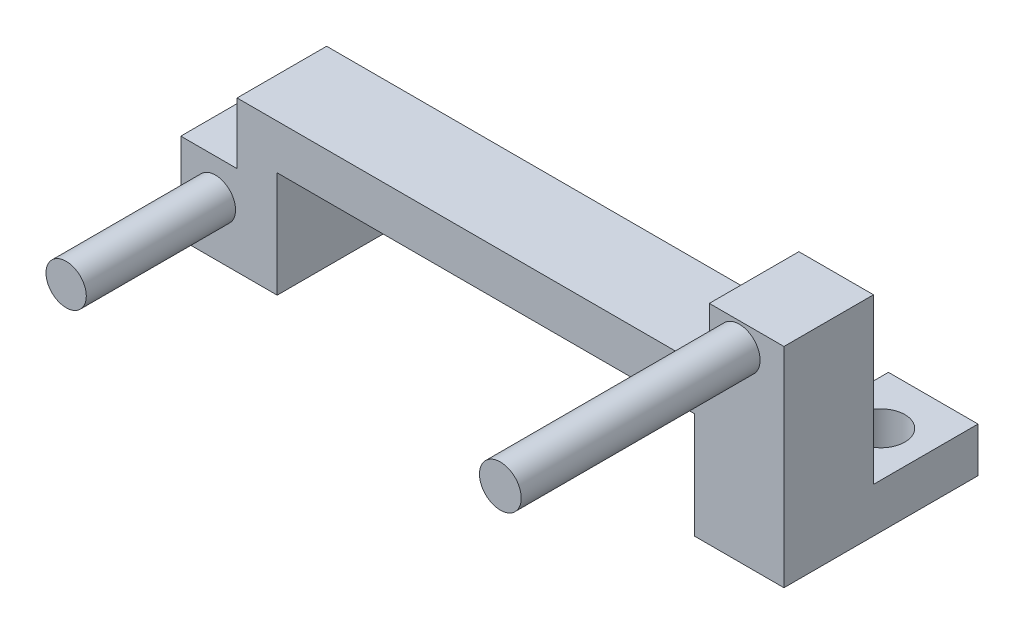
ISO-10303-21;
HEADER;
FILE_DESCRIPTION(('STEP AP214'),'2;1');
FILE_NAME('part.step','',(''),(''),'','','');
FILE_SCHEMA(('AUTOMOTIVE_DESIGN { 1 0 10303 214 1 1 1 1 }'));
ENDSEC;
DATA;
#1=APPLICATION_CONTEXT('core data for automotive mechanical design processes');
#2=APPLICATION_PROTOCOL_DEFINITION('international standard','automotive_design',2000,#1);
#3=PRODUCT_CONTEXT('',#1,'mechanical');
#4=PRODUCT('Part','Part','',(#3));
#5=PRODUCT_RELATED_PRODUCT_CATEGORY('part','',(#4));
#6=PRODUCT_DEFINITION_FORMATION('','',#4);
#7=PRODUCT_DEFINITION_CONTEXT('part definition',#1,'design');
#8=PRODUCT_DEFINITION('design','',#6,#7);
#9=PRODUCT_DEFINITION_SHAPE('','',#8);
#10=(LENGTH_UNIT() NAMED_UNIT(*) SI_UNIT(.MILLI.,.METRE.));
#11=(NAMED_UNIT(*) PLANE_ANGLE_UNIT() SI_UNIT($,.RADIAN.));
#12=(NAMED_UNIT(*) SI_UNIT($,.STERADIAN.) SOLID_ANGLE_UNIT());
#13=UNCERTAINTY_MEASURE_WITH_UNIT(LENGTH_MEASURE(1.E-05),#10,'distance_accuracy_value','');
#14=(GEOMETRIC_REPRESENTATION_CONTEXT(3) GLOBAL_UNCERTAINTY_ASSIGNED_CONTEXT((#13)) GLOBAL_UNIT_ASSIGNED_CONTEXT((#10,
#11,#12)) REPRESENTATION_CONTEXT('',''));
#15=CARTESIAN_POINT('',(0.,0.,0.));
#16=DIRECTION('',(0.,0.,1.));
#17=DIRECTION('',(1.,0.,0.));
#18=AXIS2_PLACEMENT_3D('',#15,#16,#17);
#19=CARTESIAN_POINT('',(0.,0.,20.));
#20=DIRECTION('',(0.,0.,1.));
#21=DIRECTION('',(-1.,0.,0.));
#22=AXIS2_PLACEMENT_3D('',#19,#20,#21);
#23=PLANE('',#22);
#24=DIRECTION('',(0.,1.,0.));
#25=VECTOR('',#24,1.);
#26=CARTESIAN_POINT('',(-4.43414634146342,-3.49756097560976,20.));
#27=LINE('',#26,#25);
#28=CARTESIAN_POINT('',(-4.43414634146342,-7.59756097560976,20.));
#29=VERTEX_POINT('',#28);
#30=CARTESIAN_POINT('',(-4.43414634146342,-3.49756097560976,20.));
#31=VERTEX_POINT('',#30);
#32=EDGE_CURVE('E226',#29,#31,#27,.T.);
#33=ORIENTED_EDGE('',*,*,#32,.T.);
#34=DIRECTION('',(1.,0.,0.));
#35=VECTOR('',#34,1.);
#36=CARTESIAN_POINT('',(-3.43414634146343,-3.49756097560976,20.));
#37=LINE('',#36,#35);
#38=CARTESIAN_POINT('',(-32.3841463414634,-3.49756097560976,20.));
#39=VERTEX_POINT('',#38);
#40=EDGE_CURVE('E292',#39,#31,#37,.T.);
#41=ORIENTED_EDGE('',*,*,#40,.F.);
#42=DIRECTION('',(0.,1.,0.));
#43=VECTOR('',#42,1.);
#44=CARTESIAN_POINT('',(-32.3841463414634,-3.49756097560976,20.));
#45=LINE('',#44,#43);
#46=CARTESIAN_POINT('',(-32.3841463414634,-7.59756097560976,20.));
#47=VERTEX_POINT('',#46);
#48=EDGE_CURVE('E289',#47,#39,#45,.T.);
#49=ORIENTED_EDGE('',*,*,#48,.F.);
#50=DIRECTION('',(-1.,0.,0.));
#51=VECTOR('',#50,1.);
#52=CARTESIAN_POINT('',(-32.3841463414634,-7.59756097560976,20.));
#53=LINE('',#52,#51);
#54=CARTESIAN_POINT('',(-38.8431395246063,-7.59756097560976,20.));
#55=VERTEX_POINT('',#54);
#56=EDGE_CURVE('E260',#47,#55,#53,.T.);
#57=ORIENTED_EDGE('',*,*,#56,.T.);
#58=DIRECTION('',(0.,-1.,0.));
#59=VECTOR('',#58,1.);
#60=CARTESIAN_POINT('',(-38.8431395246063,-10.5975609756098,20.));
#61=LINE('',#60,#59);
#62=CARTESIAN_POINT('',(-38.8431395246063,-4.59756097560976,20.));
#63=VERTEX_POINT('',#62);
#64=EDGE_CURVE('E312',#63,#55,#61,.T.);
#65=ORIENTED_EDGE('',*,*,#64,.F.);
#66=DIRECTION('',(-1.,0.,0.));
#67=VECTOR('',#66,1.);
#68=CARTESIAN_POINT('',(-38.8431395246063,-4.59756097560976,20.));
#69=LINE('',#68,#67);
#70=CARTESIAN_POINT('',(-35.0731395246062,-4.59756097560976,20.));
#71=VERTEX_POINT('',#70);
#72=EDGE_CURVE('E308',#71,#63,#69,.T.);
#73=ORIENTED_EDGE('',*,*,#72,.F.);
#74=DIRECTION('',(0.,-1.,0.));
#75=VECTOR('',#74,1.);
#76=CARTESIAN_POINT('',(-35.0731395246062,-4.59756097560976,20.));
#77=LINE('',#76,#75);
#78=CARTESIAN_POINT('',(-35.0731395246062,-0.497560975609762,20.));
#79=VERTEX_POINT('',#78);
#80=EDGE_CURVE('E304',#79,#71,#77,.T.);
#81=ORIENTED_EDGE('',*,*,#80,.F.);
#82=DIRECTION('',(1.,0.,0.));
#83=VECTOR('',#82,1.);
#84=CARTESIAN_POINT('',(-35.0731395246062,-0.497560975609762,20.));
#85=LINE('',#84,#83);
#86=CARTESIAN_POINT('',(-3.43414634146343,-0.497560975609757,20.));
#87=VERTEX_POINT('',#86);
#88=EDGE_CURVE('E213',#79,#87,#85,.T.);
#89=ORIENTED_EDGE('',*,*,#88,.T.);
#90=DIRECTION('',(0.,-1.,0.));
#91=VECTOR('',#90,1.);
#92=CARTESIAN_POINT('',(-3.43414634146343,-1.49756097560976,20.));
#93=LINE('',#92,#91);
#94=CARTESIAN_POINT('',(-3.43414634146343,3.40243902439024,20.));
#95=VERTEX_POINT('',#94);
#96=EDGE_CURVE('E300',#95,#87,#93,.T.);
#97=ORIENTED_EDGE('',*,*,#96,.F.);
#98=DIRECTION('',(-1.,0.,0.));
#99=VECTOR('',#98,1.);
#100=CARTESIAN_POINT('',(-3.43414634146343,3.40243902439024,20.));
#101=LINE('',#100,#99);
#102=CARTESIAN_POINT('',(1.56585365853657,3.40243902439024,20.));
#103=VERTEX_POINT('',#102);
#104=EDGE_CURVE('E296',#103,#95,#101,.T.);
#105=ORIENTED_EDGE('',*,*,#104,.F.);
#106=DIRECTION('',(0.,1.,0.));
#107=VECTOR('',#106,1.);
#108=CARTESIAN_POINT('',(1.56585365853657,3.40243902439024,20.));
#109=LINE('',#108,#107);
#110=CARTESIAN_POINT('',(1.56585365853658,-7.59756097560976,20.));
#111=VERTEX_POINT('',#110);
#112=EDGE_CURVE('E205',#111,#103,#109,.T.);
#113=ORIENTED_EDGE('',*,*,#112,.F.);
#114=DIRECTION('',(-1.,0.,0.));
#115=VECTOR('',#114,1.);
#116=CARTESIAN_POINT('',(-3.43414634146343,-7.59756097560976,20.));
#117=LINE('',#116,#115);
#118=EDGE_CURVE('E283',#111,#29,#117,.T.);
#119=ORIENTED_EDGE('',*,*,#118,.T.);
#120=EDGE_LOOP('',(#33,#41,#49,#57,#65,#73,#81,#89,#97,#105,#113,#119));
#121=FACE_BOUND('',#120,.T.);
#122=ADVANCED_FACE('F47',(#121),#23,.F.);
#123=CARTESIAN_POINT('',(-34.3841463414634,-3.49756097560976,26.));
#124=DIRECTION('',(0.,1.,0.));
#125=DIRECTION('',(-1.,0.,0.));
#126=AXIS2_PLACEMENT_3D('',#123,#124,#125);
#127=PLANE('',#126);
#128=DIRECTION('',(1.,0.,0.));
#129=VECTOR('',#128,1.);
#130=CARTESIAN_POINT('',(-34.3841463414634,-3.49756097560976,26.));
#131=LINE('',#130,#129);
#132=CARTESIAN_POINT('',(-32.3841463414634,-3.49756097560976,26.));
#133=VERTEX_POINT('',#132);
#134=CARTESIAN_POINT('',(-4.43414634146342,-3.49756097560976,26.));
#135=VERTEX_POINT('',#134);
#136=EDGE_CURVE('E341',#133,#135,#131,.T.);
#137=ORIENTED_EDGE('',*,*,#136,.F.);
#138=DIRECTION('',(0.,0.,-1.));
#139=VECTOR('',#138,1.);
#140=CARTESIAN_POINT('',(-32.3841463414634,-3.49756097560976,23.));
#141=LINE('',#140,#139);
#142=EDGE_CURVE('E358',#133,#39,#141,.T.);
#143=ORIENTED_EDGE('',*,*,#142,.T.);
#144=ORIENTED_EDGE('',*,*,#40,.T.);
#145=DIRECTION('',(0.,0.,1.));
#146=VECTOR('',#145,1.);
#147=CARTESIAN_POINT('',(-4.43414634146342,-3.49756097560976,26.));
#148=LINE('',#147,#146);
#149=EDGE_CURVE('E230',#31,#135,#148,.T.);
#150=ORIENTED_EDGE('',*,*,#149,.T.);
#151=EDGE_LOOP('',(#137,#143,#144,#150));
#152=FACE_BOUND('',#151,.T.);
#153=ADVANCED_FACE('F49',(#152),#127,.F.);
#154=CARTESIAN_POINT('',(0.,0.,26.));
#155=DIRECTION('',(0.,0.,-1.));
#156=DIRECTION('',(1.,0.,0.));
#157=AXIS2_PLACEMENT_3D('',#154,#155,#156);
#158=PLANE('',#157);
#159=CARTESIAN_POINT('',(-36.5231395246063,-7.04756097560976,26.));
#160=DIRECTION('',(0.,0.,1.));
#161=DIRECTION('',(1.,0.,0.));
#162=AXIS2_PLACEMENT_3D('',#159,#160,#161);
#163=CIRCLE('',#162,1.35);
#164=CARTESIAN_POINT('',(-35.1731395246063,-7.04756097560976,26.));
#165=VERTEX_POINT('',#164);
#166=EDGE_CURVE('E11',#165,#165,#163,.F.);
#167=ORIENTED_EDGE('',*,*,#166,.T.);
#168=EDGE_LOOP('',(#167));
#169=FACE_BOUND('',#168,.T.);
#170=CARTESIAN_POINT('',(-1.43414634146342,1.80243902439024,26.));
#171=DIRECTION('',(0.,0.,1.));
#172=DIRECTION('',(1.,0.,0.));
#173=AXIS2_PLACEMENT_3D('',#170,#171,#172);
#174=CIRCLE('',#173,1.4);
#175=CARTESIAN_POINT('',(-0.034146341463424,1.80243902439024,26.));
#176=VERTEX_POINT('',#175);
#177=EDGE_CURVE('E342',#176,#176,#174,.F.);
#178=ORIENTED_EDGE('',*,*,#177,.T.);
#179=EDGE_LOOP('',(#178));
#180=FACE_BOUND('',#179,.T.);
#181=DIRECTION('',(1.,0.,0.));
#182=VECTOR('',#181,1.);
#183=CARTESIAN_POINT('',(-35.3841463414634,-10.5975609756098,26.));
#184=LINE('',#183,#182);
#185=CARTESIAN_POINT('',(-38.8431395246063,-10.5975609756098,26.));
#186=VERTEX_POINT('',#185);
#187=CARTESIAN_POINT('',(-32.3841463414634,-10.5975609756098,26.));
#188=VERTEX_POINT('',#187);
#189=EDGE_CURVE('E364',#186,#188,#184,.T.);
#190=ORIENTED_EDGE('',*,*,#189,.T.);
#191=DIRECTION('',(0.,1.,0.));
#192=VECTOR('',#191,1.);
#193=CARTESIAN_POINT('',(-32.3841463414634,-10.5975609756098,26.));
#194=LINE('',#193,#192);
#195=EDGE_CURVE('E361',#188,#133,#194,.T.);
#196=ORIENTED_EDGE('',*,*,#195,.T.);
#197=ORIENTED_EDGE('',*,*,#136,.T.);
#198=DIRECTION('',(0.,-1.,0.));
#199=VECTOR('',#198,1.);
#200=CARTESIAN_POINT('',(-4.43414634146342,-3.49756097560976,26.));
#201=LINE('',#200,#199);
#202=CARTESIAN_POINT('',(-4.43414634146342,-10.5975609756098,26.));
#203=VERTEX_POINT('',#202);
#204=EDGE_CURVE('E172',#135,#203,#201,.T.);
#205=ORIENTED_EDGE('',*,*,#204,.T.);
#206=DIRECTION('',(1.,0.,0.));
#207=VECTOR('',#206,1.);
#208=CARTESIAN_POINT('',(-3.43414634146342,-10.5975609756098,26.));
#209=LINE('',#208,#207);
#210=CARTESIAN_POINT('',(1.56585365853658,-10.5975609756098,26.));
#211=VERTEX_POINT('',#210);
#212=EDGE_CURVE('E164',#203,#211,#209,.T.);
#213=ORIENTED_EDGE('',*,*,#212,.T.);
#214=DIRECTION('',(0.,-1.,0.));
#215=VECTOR('',#214,1.);
#216=CARTESIAN_POINT('',(1.56585365853658,-10.5975609756098,26.));
#217=LINE('',#216,#215);
#218=CARTESIAN_POINT('',(1.56585365853657,3.40243902439024,26.));
#219=VERTEX_POINT('',#218);
#220=EDGE_CURVE('E170',#219,#211,#217,.T.);
#221=ORIENTED_EDGE('',*,*,#220,.F.);
#222=DIRECTION('',(-1.,0.,0.));
#223=VECTOR('',#222,1.);
#224=CARTESIAN_POINT('',(-3.43414634146343,3.40243902439024,26.));
#225=LINE('',#224,#223);
#226=CARTESIAN_POINT('',(-3.43414634146343,3.40243902439024,26.));
#227=VERTEX_POINT('',#226);
#228=EDGE_CURVE('E176',#219,#227,#225,.T.);
#229=ORIENTED_EDGE('',*,*,#228,.T.);
#230=DIRECTION('',(0.,-1.,0.));
#231=VECTOR('',#230,1.);
#232=CARTESIAN_POINT('',(-3.43414634146343,3.40243902439024,26.));
#233=LINE('',#232,#231);
#234=CARTESIAN_POINT('',(-3.43414634146343,-0.497560975609757,26.));
#235=VERTEX_POINT('',#234);
#236=EDGE_CURVE('E177',#227,#235,#233,.T.);
#237=ORIENTED_EDGE('',*,*,#236,.T.);
#238=DIRECTION('',(-1.,0.,0.));
#239=VECTOR('',#238,1.);
#240=CARTESIAN_POINT('',(-35.0731395246062,-0.497560975609762,26.));
#241=LINE('',#240,#239);
#242=CARTESIAN_POINT('',(-35.0731395246062,-0.497560975609762,26.));
#243=VERTEX_POINT('',#242);
#244=EDGE_CURVE('E220',#235,#243,#241,.T.);
#245=ORIENTED_EDGE('',*,*,#244,.T.);
#246=DIRECTION('',(0.,-1.,0.));
#247=VECTOR('',#246,1.);
#248=CARTESIAN_POINT('',(-35.0731395246062,-1.49756097560976,26.));
#249=LINE('',#248,#247);
#250=CARTESIAN_POINT('',(-35.0731395246062,-4.59756097560976,26.));
#251=VERTEX_POINT('',#250);
#252=EDGE_CURVE('E337',#243,#251,#249,.T.);
#253=ORIENTED_EDGE('',*,*,#252,.T.);
#254=DIRECTION('',(1.,0.,0.));
#255=VECTOR('',#254,1.);
#256=CARTESIAN_POINT('',(-38.8431395246063,-4.59756097560976,26.));
#257=LINE('',#256,#255);
#258=CARTESIAN_POINT('',(-38.8431395246063,-4.59756097560976,26.));
#259=VERTEX_POINT('',#258);
#260=EDGE_CURVE('E331',#259,#251,#257,.T.);
#261=ORIENTED_EDGE('',*,*,#260,.F.);
#262=DIRECTION('',(0.,-1.,0.));
#263=VECTOR('',#262,1.);
#264=CARTESIAN_POINT('',(-38.8431395246063,-4.59756097560976,26.));
#265=LINE('',#264,#263);
#266=EDGE_CURVE('E320',#259,#186,#265,.T.);
#267=ORIENTED_EDGE('',*,*,#266,.T.);
#268=EDGE_LOOP('',(#190,#196,#197,#205,#213,#221,#229,#237,#245,#253,#261,#267));
#269=FACE_BOUND('',#268,.T.);
#270=ADVANCED_FACE('F167',(#169,#180,#269),#158,.F.);
#271=CARTESIAN_POINT('',(-3.43414634146343,3.40243902439024,23.));
#272=DIRECTION('',(1.,0.,0.));
#273=DIRECTION('',(0.,1.,0.));
#274=AXIS2_PLACEMENT_3D('',#271,#272,#273);
#275=PLANE('',#274);
#276=ORIENTED_EDGE('',*,*,#236,.F.);
#277=DIRECTION('',(0.,0.,1.));
#278=VECTOR('',#277,1.);
#279=CARTESIAN_POINT('',(-3.43414634146343,3.40243902439024,23.));
#280=LINE('',#279,#278);
#281=EDGE_CURVE('E347',#95,#227,#280,.T.);
#282=ORIENTED_EDGE('',*,*,#281,.F.);
#283=ORIENTED_EDGE('',*,*,#96,.T.);
#284=DIRECTION('',(0.,0.,1.));
#285=VECTOR('',#284,1.);
#286=CARTESIAN_POINT('',(-3.43414634146343,-0.497560975609757,26.));
#287=LINE('',#286,#285);
#288=EDGE_CURVE('E217',#87,#235,#287,.T.);
#289=ORIENTED_EDGE('',*,*,#288,.T.);
#290=EDGE_LOOP('',(#276,#282,#283,#289));
#291=FACE_BOUND('',#290,.T.);
#292=ADVANCED_FACE('F401',(#291),#275,.F.);
#293=CARTESIAN_POINT('',(-3.43414634146342,-10.5975609756098,23.));
#294=DIRECTION('',(0.,1.,0.));
#295=DIRECTION('',(0.,0.,-1.));
#296=AXIS2_PLACEMENT_3D('',#293,#294,#295);
#297=PLANE('',#296);
#298=DIRECTION('',(0.,0.,-1.));
#299=VECTOR('',#298,1.);
#300=CARTESIAN_POINT('',(-4.43414634146342,-10.5975609756098,20.));
#301=LINE('',#300,#299);
#302=CARTESIAN_POINT('',(-4.43414634146342,-10.5975609756098,13.));
#303=VERTEX_POINT('',#302);
#304=EDGE_CURVE('E234',#203,#303,#301,.T.);
#305=ORIENTED_EDGE('',*,*,#304,.T.);
#306=DIRECTION('',(1.,0.,0.));
#307=VECTOR('',#306,1.);
#308=CARTESIAN_POINT('',(-3.43414634146343,-10.5975609756098,13.));
#309=LINE('',#308,#307);
#310=CARTESIAN_POINT('',(1.56585365853658,-10.5975609756098,13.));
#311=VERTEX_POINT('',#310);
#312=EDGE_CURVE('E184',#303,#311,#309,.T.);
#313=ORIENTED_EDGE('',*,*,#312,.T.);
#314=DIRECTION('',(0.,0.,-1.));
#315=VECTOR('',#314,1.);
#316=CARTESIAN_POINT('',(1.56585365853658,-10.5975609756098,13.));
#317=LINE('',#316,#315);
#318=EDGE_CURVE('E180',#211,#311,#317,.T.);
#319=ORIENTED_EDGE('',*,*,#318,.F.);
#320=ORIENTED_EDGE('',*,*,#212,.F.);
#321=EDGE_LOOP('',(#305,#313,#319,#320));
#322=FACE_BOUND('',#321,.T.);
#323=CARTESIAN_POINT('',(-1.43414634146343,-10.5975609756098,16.5));
#324=DIRECTION('',(0.,-1.,0.));
#325=DIRECTION('',(0.,0.,-1.));
#326=AXIS2_PLACEMENT_3D('',#323,#324,#325);
#327=CIRCLE('',#326,1.6);
#328=CARTESIAN_POINT('',(-1.43414634146343,-10.5975609756098,14.9));
#329=VERTEX_POINT('',#328);
#330=EDGE_CURVE('E248',#329,#329,#327,.T.);
#331=ORIENTED_EDGE('',*,*,#330,.F.);
#332=EDGE_LOOP('',(#331));
#333=FACE_BOUND('',#332,.T.);
#334=ADVANCED_FACE('F181',(#322,#333),#297,.F.);
#335=CARTESIAN_POINT('',(-3.43414634146343,3.40243902439024,23.));
#336=DIRECTION('',(0.,-1.,0.));
#337=DIRECTION('',(0.,0.,1.));
#338=AXIS2_PLACEMENT_3D('',#335,#336,#337);
#339=PLANE('',#338);
#340=ORIENTED_EDGE('',*,*,#228,.F.);
#341=DIRECTION('',(0.,0.,1.));
#342=VECTOR('',#341,1.);
#343=CARTESIAN_POINT('',(1.56585365853657,3.40243902439024,26.));
#344=LINE('',#343,#342);
#345=EDGE_CURVE('E195',#103,#219,#344,.T.);
#346=ORIENTED_EDGE('',*,*,#345,.F.);
#347=ORIENTED_EDGE('',*,*,#104,.T.);
#348=ORIENTED_EDGE('',*,*,#281,.T.);
#349=EDGE_LOOP('',(#340,#346,#347,#348));
#350=FACE_BOUND('',#349,.T.);
#351=ADVANCED_FACE('F397',(#350),#339,.F.);
#352=CARTESIAN_POINT('',(-1.43414634146342,1.80243902439024,42.));
#353=DIRECTION('',(0.,0.,-1.));
#354=DIRECTION('',(1.,0.,0.));
#355=AXIS2_PLACEMENT_3D('',#352,#353,#354);
#356=CYLINDRICAL_SURFACE('',#355,1.4);
#357=CARTESIAN_POINT('',(-1.43414634146342,1.80243902439024,42.));
#358=DIRECTION('',(0.,0.,-1.));
#359=DIRECTION('',(-1.,0.,0.));
#360=AXIS2_PLACEMENT_3D('',#357,#358,#359);
#361=CIRCLE('',#360,1.4);
#362=CARTESIAN_POINT('',(-2.83414634146342,1.80243902439024,42.));
#363=VERTEX_POINT('',#362);
#364=EDGE_CURVE('E346',#363,#363,#361,.T.);
#365=ORIENTED_EDGE('',*,*,#364,.T.);
#366=EDGE_LOOP('',(#365));
#367=FACE_BOUND('',#366,.T.);
#368=ORIENTED_EDGE('',*,*,#177,.F.);
#369=EDGE_LOOP('',(#368));
#370=FACE_BOUND('',#369,.T.);
#371=ADVANCED_FACE('F459',(#367,#370),#356,.T.);
#372=CARTESIAN_POINT('',(-1.43414634146342,1.80243902439024,42.));
#373=DIRECTION('',(0.,0.,1.));
#374=DIRECTION('',(-1.,0.,0.));
#375=AXIS2_PLACEMENT_3D('',#372,#373,#374);
#376=PLANE('',#375);
#377=ORIENTED_EDGE('',*,*,#364,.F.);
#378=EDGE_LOOP('',(#377));
#379=FACE_BOUND('',#378,.T.);
#380=ADVANCED_FACE('F464',(#379),#376,.T.);
#381=CARTESIAN_POINT('',(-32.3841463414634,-10.5975609756098,23.));
#382=DIRECTION('',(-1.,0.,0.));
#383=DIRECTION('',(0.,-1.,0.));
#384=AXIS2_PLACEMENT_3D('',#381,#382,#383);
#385=PLANE('',#384);
#386=ORIENTED_EDGE('',*,*,#142,.F.);
#387=ORIENTED_EDGE('',*,*,#195,.F.);
#388=DIRECTION('',(0.,0.,-1.));
#389=VECTOR('',#388,1.);
#390=CARTESIAN_POINT('',(-32.3841463414634,-10.5975609756098,23.));
#391=LINE('',#390,#389);
#392=CARTESIAN_POINT('',(-32.3841463414634,-10.5975609756098,13.));
#393=VERTEX_POINT('',#392);
#394=EDGE_CURVE('E56',#188,#393,#391,.T.);
#395=ORIENTED_EDGE('',*,*,#394,.T.);
#396=DIRECTION('',(0.,1.,0.));
#397=VECTOR('',#396,1.);
#398=CARTESIAN_POINT('',(-32.3841463414634,-10.5975609756098,13.));
#399=LINE('',#398,#397);
#400=CARTESIAN_POINT('',(-32.3841463414634,-7.59756097560976,13.));
#401=VERTEX_POINT('',#400);
#402=EDGE_CURVE('E261',#393,#401,#399,.T.);
#403=ORIENTED_EDGE('',*,*,#402,.T.);
#404=DIRECTION('',(0.,0.,1.));
#405=VECTOR('',#404,1.);
#406=CARTESIAN_POINT('',(-32.3841463414634,-7.59756097560976,13.));
#407=LINE('',#406,#405);
#408=EDGE_CURVE('E63',#401,#47,#407,.T.);
#409=ORIENTED_EDGE('',*,*,#408,.T.);
#410=ORIENTED_EDGE('',*,*,#48,.T.);
#411=EDGE_LOOP('',(#386,#387,#395,#403,#409,#410));
#412=FACE_BOUND('',#411,.T.);
#413=ADVANCED_FACE('F379',(#412),#385,.F.);
#414=CARTESIAN_POINT('',(0.,-10.5975609756098,26.));
#415=DIRECTION('',(0.,-1.,0.));
#416=DIRECTION('',(0.,0.,1.));
#417=AXIS2_PLACEMENT_3D('',#414,#415,#416);
#418=PLANE('',#417);
#419=CARTESIAN_POINT('',(-35.6136429330348,-10.5975609756098,16.5));
#420=DIRECTION('',(0.,1.,0.));
#421=DIRECTION('',(0.,0.,1.));
#422=AXIS2_PLACEMENT_3D('',#419,#420,#421);
#423=CIRCLE('',#422,1.6);
#424=CARTESIAN_POINT('',(-35.6136429330348,-10.5975609756098,18.1));
#425=VERTEX_POINT('',#424);
#426=EDGE_CURVE('E256',#425,#425,#423,.T.);
#427=ORIENTED_EDGE('',*,*,#426,.T.);
#428=EDGE_LOOP('',(#427));
#429=FACE_BOUND('',#428,.T.);
#430=ORIENTED_EDGE('',*,*,#394,.F.);
#431=ORIENTED_EDGE('',*,*,#189,.F.);
#432=DIRECTION('',(0.,0.,-1.));
#433=VECTOR('',#432,1.);
#434=CARTESIAN_POINT('',(-38.8431395246063,-10.5975609756098,26.));
#435=LINE('',#434,#433);
#436=CARTESIAN_POINT('',(-38.8431395246063,-10.5975609756098,13.));
#437=VERTEX_POINT('',#436);
#438=EDGE_CURVE('E324',#186,#437,#435,.T.);
#439=ORIENTED_EDGE('',*,*,#438,.T.);
#440=DIRECTION('',(1.,0.,0.));
#441=VECTOR('',#440,1.);
#442=CARTESIAN_POINT('',(-32.3841463414634,-10.5975609756098,13.));
#443=LINE('',#442,#441);
#444=EDGE_CURVE('E270',#437,#393,#443,.T.);
#445=ORIENTED_EDGE('',*,*,#444,.T.);
#446=EDGE_LOOP('',(#430,#431,#439,#445));
#447=FACE_BOUND('',#446,.T.);
#448=ADVANCED_FACE('F376',(#429,#447),#418,.T.);
#449=CARTESIAN_POINT('',(-35.0731395246062,0.,26.));
#450=DIRECTION('',(-1.,0.,0.));
#451=DIRECTION('',(0.,0.,-1.));
#452=AXIS2_PLACEMENT_3D('',#449,#450,#451);
#453=PLANE('',#452);
#454=DIRECTION('',(0.,0.,1.));
#455=VECTOR('',#454,1.);
#456=CARTESIAN_POINT('',(-35.0731395246062,-4.59756097560976,26.));
#457=LINE('',#456,#455);
#458=EDGE_CURVE('E319',#71,#251,#457,.T.);
#459=ORIENTED_EDGE('',*,*,#458,.T.);
#460=ORIENTED_EDGE('',*,*,#252,.F.);
#461=DIRECTION('',(0.,0.,-1.));
#462=VECTOR('',#461,1.);
#463=CARTESIAN_POINT('',(-35.0731395246062,-0.497560975609762,26.));
#464=LINE('',#463,#462);
#465=EDGE_CURVE('E210',#243,#79,#464,.T.);
#466=ORIENTED_EDGE('',*,*,#465,.T.);
#467=ORIENTED_EDGE('',*,*,#80,.T.);
#468=EDGE_LOOP('',(#459,#460,#466,#467));
#469=FACE_BOUND('',#468,.T.);
#470=ADVANCED_FACE('F408',(#469),#453,.T.);
#471=CARTESIAN_POINT('',(-38.8431395246063,-4.59756097560976,26.));
#472=DIRECTION('',(0.,-1.,0.));
#473=DIRECTION('',(0.,0.,1.));
#474=AXIS2_PLACEMENT_3D('',#471,#472,#473);
#475=PLANE('',#474);
#476=ORIENTED_EDGE('',*,*,#458,.F.);
#477=ORIENTED_EDGE('',*,*,#72,.T.);
#478=DIRECTION('',(0.,0.,1.));
#479=VECTOR('',#478,1.);
#480=CARTESIAN_POINT('',(-38.8431395246063,-4.59756097560976,26.));
#481=LINE('',#480,#479);
#482=EDGE_CURVE('E328',#63,#259,#481,.T.);
#483=ORIENTED_EDGE('',*,*,#482,.T.);
#484=ORIENTED_EDGE('',*,*,#260,.T.);
#485=EDGE_LOOP('',(#476,#477,#483,#484));
#486=FACE_BOUND('',#485,.T.);
#487=ADVANCED_FACE('F410',(#486),#475,.F.);
#488=CARTESIAN_POINT('',(-38.8431395246063,0.,26.));
#489=DIRECTION('',(-1.,0.,0.));
#490=DIRECTION('',(0.,0.,-1.));
#491=AXIS2_PLACEMENT_3D('',#488,#489,#490);
#492=PLANE('',#491);
#493=ORIENTED_EDGE('',*,*,#266,.F.);
#494=ORIENTED_EDGE('',*,*,#482,.F.);
#495=ORIENTED_EDGE('',*,*,#64,.T.);
#496=DIRECTION('',(0.,0.,1.));
#497=VECTOR('',#496,1.);
#498=CARTESIAN_POINT('',(-38.8431395246063,-7.59756097560976,13.));
#499=LINE('',#498,#497);
#500=CARTESIAN_POINT('',(-38.8431395246063,-7.59756097560976,13.));
#501=VERTEX_POINT('',#500);
#502=EDGE_CURVE('E70',#501,#55,#499,.T.);
#503=ORIENTED_EDGE('',*,*,#502,.F.);
#504=DIRECTION('',(0.,-1.,0.));
#505=VECTOR('',#504,1.);
#506=CARTESIAN_POINT('',(-38.8431395246063,-10.5975609756098,13.));
#507=LINE('',#506,#505);
#508=EDGE_CURVE('E267',#501,#437,#507,.T.);
#509=ORIENTED_EDGE('',*,*,#508,.T.);
#510=ORIENTED_EDGE('',*,*,#438,.F.);
#511=EDGE_LOOP('',(#493,#494,#495,#503,#509,#510));
#512=FACE_BOUND('',#511,.T.);
#513=ADVANCED_FACE('F414',(#512),#492,.T.);
#514=CARTESIAN_POINT('',(-36.5231395246063,-7.04756097560976,36.));
#515=DIRECTION('',(0.,0.,-1.));
#516=DIRECTION('',(1.,0.,0.));
#517=AXIS2_PLACEMENT_3D('',#514,#515,#516);
#518=CYLINDRICAL_SURFACE('',#517,1.35);
#519=CARTESIAN_POINT('',(-36.5231395246063,-7.04756097560976,36.));
#520=DIRECTION('',(0.,0.,-1.));
#521=DIRECTION('',(-1.,0.,0.));
#522=AXIS2_PLACEMENT_3D('',#519,#520,#521);
#523=CIRCLE('',#522,1.35);
#524=CARTESIAN_POINT('',(-37.8731395246062,-7.04756097560976,36.));
#525=VERTEX_POINT('',#524);
#526=EDGE_CURVE('E315',#525,#525,#523,.T.);
#527=ORIENTED_EDGE('',*,*,#526,.T.);
#528=EDGE_LOOP('',(#527));
#529=FACE_BOUND('',#528,.T.);
#530=ORIENTED_EDGE('',*,*,#166,.F.);
#531=EDGE_LOOP('',(#530));
#532=FACE_BOUND('',#531,.T.);
#533=ADVANCED_FACE('F442',(#529,#532),#518,.T.);
#534=CARTESIAN_POINT('',(-36.5231395246063,-7.04756097560976,36.));
#535=DIRECTION('',(0.,0.,1.));
#536=DIRECTION('',(-1.,0.,0.));
#537=AXIS2_PLACEMENT_3D('',#534,#535,#536);
#538=PLANE('',#537);
#539=ORIENTED_EDGE('',*,*,#526,.F.);
#540=EDGE_LOOP('',(#539));
#541=FACE_BOUND('',#540,.T.);
#542=ADVANCED_FACE('F440',(#541),#538,.T.);
#543=CARTESIAN_POINT('',(0.,0.,13.));
#544=DIRECTION('',(0.,0.,-1.));
#545=DIRECTION('',(1.,0.,0.));
#546=AXIS2_PLACEMENT_3D('',#543,#544,#545);
#547=PLANE('',#546);
#548=DIRECTION('',(1.,0.,0.));
#549=VECTOR('',#548,1.);
#550=CARTESIAN_POINT('',(-3.43414634146343,-7.59756097560976,13.));
#551=LINE('',#550,#549);
#552=CARTESIAN_POINT('',(-4.43414634146342,-7.59756097560976,13.));
#553=VERTEX_POINT('',#552);
#554=CARTESIAN_POINT('',(1.56585365853658,-7.59756097560976,13.));
#555=VERTEX_POINT('',#554);
#556=EDGE_CURVE('E280',#553,#555,#551,.T.);
#557=ORIENTED_EDGE('',*,*,#556,.T.);
#558=DIRECTION('',(0.,1.,0.));
#559=VECTOR('',#558,1.);
#560=CARTESIAN_POINT('',(1.56585365853658,-7.59756097560976,13.));
#561=LINE('',#560,#559);
#562=EDGE_CURVE('E189',#311,#555,#561,.T.);
#563=ORIENTED_EDGE('',*,*,#562,.F.);
#564=ORIENTED_EDGE('',*,*,#312,.F.);
#565=DIRECTION('',(0.,1.,0.));
#566=VECTOR('',#565,1.);
#567=CARTESIAN_POINT('',(-4.43414634146342,-7.59756097560976,13.));
#568=LINE('',#567,#566);
#569=EDGE_CURVE('E237',#303,#553,#568,.T.);
#570=ORIENTED_EDGE('',*,*,#569,.T.);
#571=EDGE_LOOP('',(#557,#563,#564,#570));
#572=FACE_BOUND('',#571,.T.);
#573=ADVANCED_FACE('F389',(#572),#547,.T.);
#574=CARTESIAN_POINT('',(0.,-7.59756097560976,26.));
#575=DIRECTION('',(0.,1.,0.));
#576=DIRECTION('',(0.,0.,-1.));
#577=AXIS2_PLACEMENT_3D('',#574,#575,#576);
#578=PLANE('',#577);
#579=CARTESIAN_POINT('',(-1.43414634146343,-7.59756097560976,16.5));
#580=DIRECTION('',(0.,-1.,0.));
#581=DIRECTION('',(0.,0.,-1.));
#582=AXIS2_PLACEMENT_3D('',#579,#580,#581);
#583=CIRCLE('',#582,1.6);
#584=CARTESIAN_POINT('',(-1.43414634146343,-7.59756097560976,14.9));
#585=VERTEX_POINT('',#584);
#586=EDGE_CURVE('E244',#585,#585,#583,.T.);
#587=ORIENTED_EDGE('',*,*,#586,.T.);
#588=EDGE_LOOP('',(#587));
#589=FACE_BOUND('',#588,.T.);
#590=ORIENTED_EDGE('',*,*,#118,.F.);
#591=DIRECTION('',(0.,0.,1.));
#592=VECTOR('',#591,1.);
#593=CARTESIAN_POINT('',(1.56585365853658,-7.59756097560976,20.));
#594=LINE('',#593,#592);
#595=EDGE_CURVE('E201',#555,#111,#594,.T.);
#596=ORIENTED_EDGE('',*,*,#595,.F.);
#597=ORIENTED_EDGE('',*,*,#556,.F.);
#598=DIRECTION('',(0.,0.,1.));
#599=VECTOR('',#598,1.);
#600=CARTESIAN_POINT('',(-4.43414634146342,-7.59756097560976,20.));
#601=LINE('',#600,#599);
#602=EDGE_CURVE('E241',#553,#29,#601,.T.);
#603=ORIENTED_EDGE('',*,*,#602,.T.);
#604=EDGE_LOOP('',(#590,#596,#597,#603));
#605=FACE_BOUND('',#604,.T.);
#606=ADVANCED_FACE('F393',(#589,#605),#578,.T.);
#607=CARTESIAN_POINT('',(-32.3841463414634,-7.59756097560976,13.));
#608=DIRECTION('',(0.,-1.,0.));
#609=DIRECTION('',(0.,0.,1.));
#610=AXIS2_PLACEMENT_3D('',#607,#608,#609);
#611=PLANE('',#610);
#612=CARTESIAN_POINT('',(-35.6136429330348,-7.59756097560976,16.5));
#613=DIRECTION('',(0.,-1.,0.));
#614=DIRECTION('',(0.,0.,-1.));
#615=AXIS2_PLACEMENT_3D('',#612,#613,#614);
#616=CIRCLE('',#615,1.6);
#617=CARTESIAN_POINT('',(-35.6136429330348,-7.59756097560976,14.9));
#618=VERTEX_POINT('',#617);
#619=EDGE_CURVE('E252',#618,#618,#616,.T.);
#620=ORIENTED_EDGE('',*,*,#619,.T.);
#621=EDGE_LOOP('',(#620));
#622=FACE_BOUND('',#621,.T.);
#623=ORIENTED_EDGE('',*,*,#56,.F.);
#624=ORIENTED_EDGE('',*,*,#408,.F.);
#625=DIRECTION('',(-1.,0.,0.));
#626=VECTOR('',#625,1.);
#627=CARTESIAN_POINT('',(-32.3841463414634,-7.59756097560976,13.));
#628=LINE('',#627,#626);
#629=EDGE_CURVE('E264',#401,#501,#628,.T.);
#630=ORIENTED_EDGE('',*,*,#629,.T.);
#631=ORIENTED_EDGE('',*,*,#502,.T.);
#632=EDGE_LOOP('',(#623,#624,#630,#631));
#633=FACE_BOUND('',#632,.T.);
#634=ADVANCED_FACE('F418',(#622,#633),#611,.F.);
#635=CARTESIAN_POINT('',(0.,0.,13.));
#636=DIRECTION('',(0.,0.,-1.));
#637=DIRECTION('',(1.,0.,0.));
#638=AXIS2_PLACEMENT_3D('',#635,#636,#637);
#639=PLANE('',#638);
#640=ORIENTED_EDGE('',*,*,#402,.F.);
#641=ORIENTED_EDGE('',*,*,#444,.F.);
#642=ORIENTED_EDGE('',*,*,#508,.F.);
#643=ORIENTED_EDGE('',*,*,#629,.F.);
#644=EDGE_LOOP('',(#640,#641,#642,#643));
#645=FACE_BOUND('',#644,.T.);
#646=ADVANCED_FACE('F417',(#645),#639,.T.);
#647=CARTESIAN_POINT('',(-35.6136429330348,-14.5975609756098,16.5));
#648=DIRECTION('',(0.,1.,0.));
#649=DIRECTION('',(0.,0.,-1.));
#650=AXIS2_PLACEMENT_3D('',#647,#648,#649);
#651=CYLINDRICAL_SURFACE('',#650,1.6);
#652=ORIENTED_EDGE('',*,*,#426,.F.);
#653=EDGE_LOOP('',(#652));
#654=FACE_BOUND('',#653,.T.);
#655=ORIENTED_EDGE('',*,*,#619,.F.);
#656=EDGE_LOOP('',(#655));
#657=FACE_BOUND('',#656,.T.);
#658=ADVANCED_FACE('F426',(#654,#657),#651,.F.);
#659=CARTESIAN_POINT('',(-1.43414634146343,-14.5975609756098,16.5));
#660=DIRECTION('',(0.,1.,0.));
#661=DIRECTION('',(0.,0.,-1.));
#662=AXIS2_PLACEMENT_3D('',#659,#660,#661);
#663=CYLINDRICAL_SURFACE('',#662,1.6);
#664=ORIENTED_EDGE('',*,*,#586,.F.);
#665=EDGE_LOOP('',(#664));
#666=FACE_BOUND('',#665,.T.);
#667=ORIENTED_EDGE('',*,*,#330,.T.);
#668=EDGE_LOOP('',(#667));
#669=FACE_BOUND('',#668,.T.);
#670=ADVANCED_FACE('F478',(#666,#669),#663,.F.);
#671=CARTESIAN_POINT('',(-4.43414634146342,0.,26.));
#672=DIRECTION('',(-1.,0.,0.));
#673=DIRECTION('',(0.,-1.,0.));
#674=AXIS2_PLACEMENT_3D('',#671,#672,#673);
#675=PLANE('',#674);
#676=ORIENTED_EDGE('',*,*,#602,.F.);
#677=ORIENTED_EDGE('',*,*,#569,.F.);
#678=ORIENTED_EDGE('',*,*,#304,.F.);
#679=ORIENTED_EDGE('',*,*,#204,.F.);
#680=ORIENTED_EDGE('',*,*,#149,.F.);
#681=ORIENTED_EDGE('',*,*,#32,.F.);
#682=EDGE_LOOP('',(#676,#677,#678,#679,#680,#681));
#683=FACE_BOUND('',#682,.T.);
#684=ADVANCED_FACE('F386',(#683),#675,.T.);
#685=CARTESIAN_POINT('',(0.,-0.497560975609757,26.));
#686=DIRECTION('',(0.,1.,0.));
#687=DIRECTION('',(-1.,0.,0.));
#688=AXIS2_PLACEMENT_3D('',#685,#686,#687);
#689=PLANE('',#688);
#690=ORIENTED_EDGE('',*,*,#465,.F.);
#691=ORIENTED_EDGE('',*,*,#244,.F.);
#692=ORIENTED_EDGE('',*,*,#288,.F.);
#693=ORIENTED_EDGE('',*,*,#88,.F.);
#694=EDGE_LOOP('',(#690,#691,#692,#693));
#695=FACE_BOUND('',#694,.T.);
#696=ADVANCED_FACE('F404',(#695),#689,.T.);
#697=CARTESIAN_POINT('',(1.56585365853658,0.,0.));
#698=DIRECTION('',(-1.,0.,0.));
#699=DIRECTION('',(0.,-1.,0.));
#700=AXIS2_PLACEMENT_3D('',#697,#698,#699);
#701=PLANE('',#700);
#702=ORIENTED_EDGE('',*,*,#220,.T.);
#703=ORIENTED_EDGE('',*,*,#318,.T.);
#704=ORIENTED_EDGE('',*,*,#562,.T.);
#705=ORIENTED_EDGE('',*,*,#595,.T.);
#706=ORIENTED_EDGE('',*,*,#112,.T.);
#707=ORIENTED_EDGE('',*,*,#345,.T.);
#708=EDGE_LOOP('',(#702,#703,#704,#705,#706,#707));
#709=FACE_BOUND('',#708,.T.);
#710=ADVANCED_FACE('F192',(#709),#701,.F.);
#711=CLOSED_SHELL('',(#122,#153,#270,#292,#334,#351,#371,#380,#413,#448,#470,#487,#513,#533,
#542,#573,#606,#634,#646,#658,#670,#684,#696,#710));
#712=MANIFOLD_SOLID_BREP('B2',#711);
#713=ADVANCED_BREP_SHAPE_REPRESENTATION('',(#18,#712),#14);
#714=SHAPE_DEFINITION_REPRESENTATION(#9,#713);
ENDSEC;
END-ISO-10303-21;
